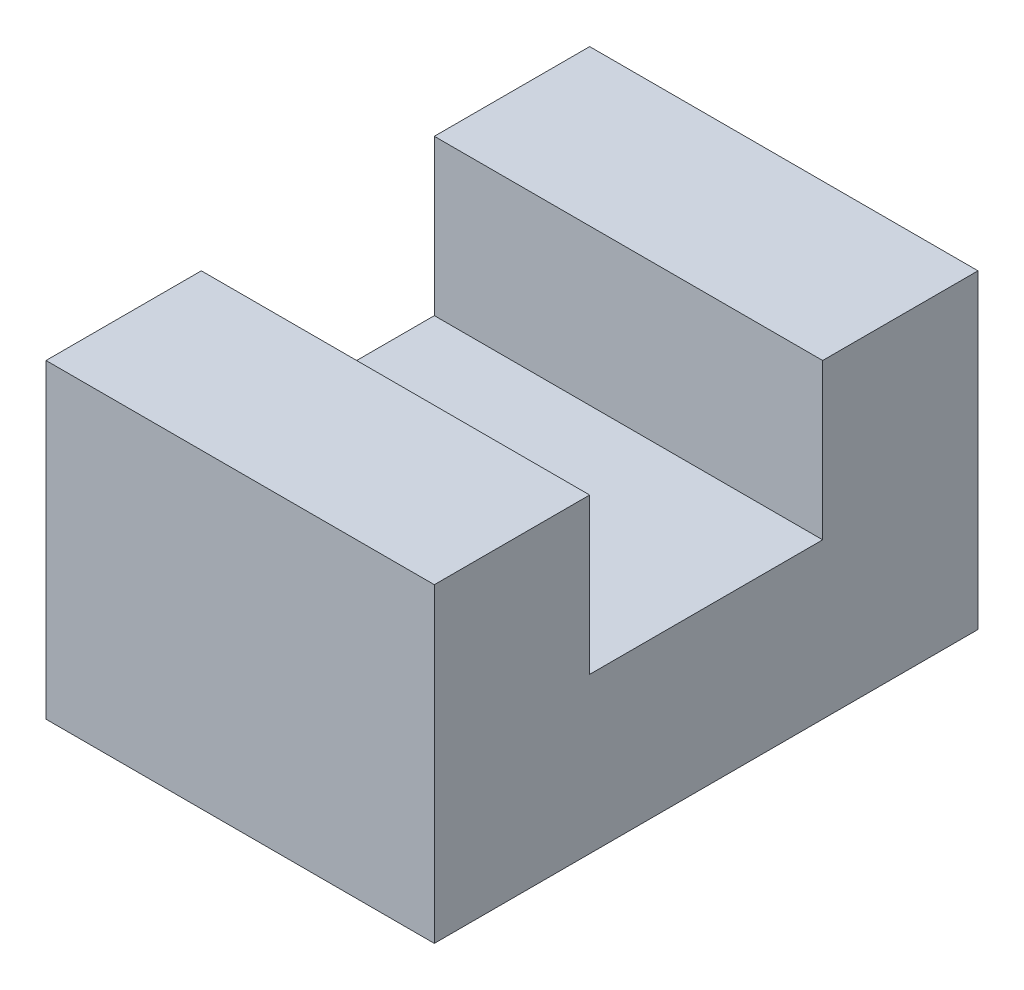
ISO-10303-21;
HEADER;
FILE_DESCRIPTION(('STEP AP214'),'2;1');
FILE_NAME('part.step','',(''),(''),'','','');
FILE_SCHEMA(('AUTOMOTIVE_DESIGN { 1 0 10303 214 1 1 1 1 }'));
ENDSEC;
DATA;
#1=APPLICATION_CONTEXT('core data for automotive mechanical design processes');
#2=APPLICATION_PROTOCOL_DEFINITION('international standard','automotive_design',2000,#1);
#3=PRODUCT_CONTEXT('',#1,'mechanical');
#4=PRODUCT('Part','Part','',(#3));
#5=PRODUCT_RELATED_PRODUCT_CATEGORY('part','',(#4));
#6=PRODUCT_DEFINITION_FORMATION('','',#4);
#7=PRODUCT_DEFINITION_CONTEXT('part definition',#1,'design');
#8=PRODUCT_DEFINITION('design','',#6,#7);
#9=PRODUCT_DEFINITION_SHAPE('','',#8);
#10=(LENGTH_UNIT() NAMED_UNIT(*) SI_UNIT(.MILLI.,.METRE.));
#11=(NAMED_UNIT(*) PLANE_ANGLE_UNIT() SI_UNIT($,.RADIAN.));
#12=(NAMED_UNIT(*) SI_UNIT($,.STERADIAN.) SOLID_ANGLE_UNIT());
#13=UNCERTAINTY_MEASURE_WITH_UNIT(LENGTH_MEASURE(1.E-05),#10,'distance_accuracy_value','');
#14=(GEOMETRIC_REPRESENTATION_CONTEXT(3) GLOBAL_UNCERTAINTY_ASSIGNED_CONTEXT((#13)) GLOBAL_UNIT_ASSIGNED_CONTEXT((#10,
#11,#12)) REPRESENTATION_CONTEXT('',''));
#15=CARTESIAN_POINT('',(0.,0.,0.));
#16=DIRECTION('',(0.,0.,1.));
#17=DIRECTION('',(1.,0.,0.));
#18=AXIS2_PLACEMENT_3D('',#15,#16,#17);
#19=CARTESIAN_POINT('',(0.,2.,0.));
#20=DIRECTION('',(0.,1.,0.));
#21=DIRECTION('',(0.,0.,1.));
#22=AXIS2_PLACEMENT_3D('',#19,#20,#21);
#23=PLANE('',#22);
#24=DIRECTION('',(0.,0.,1.));
#25=VECTOR('',#24,1.);
#26=CARTESIAN_POINT('',(-10.0524129011398,2.,22.6417303495147));
#27=LINE('',#26,#25);
#28=CARTESIAN_POINT('',(-10.0524129011398,2.,24.6417303495147));
#29=VERTEX_POINT('',#28);
#30=CARTESIAN_POINT('',(-10.0524129011398,2.,27.6417303495147));
#31=VERTEX_POINT('',#30);
#32=EDGE_CURVE('E145',#29,#31,#27,.T.);
#33=ORIENTED_EDGE('',*,*,#32,.T.);
#34=DIRECTION('',(-1.,0.,0.));
#35=VECTOR('',#34,1.);
#36=CARTESIAN_POINT('',(-10.0524129011398,2.,27.6417303495147));
#37=LINE('',#36,#35);
#38=CARTESIAN_POINT('',(-5.05241290113979,2.,27.6417303495147));
#39=VERTEX_POINT('',#38);
#40=EDGE_CURVE('E118',#39,#31,#37,.T.);
#41=ORIENTED_EDGE('',*,*,#40,.F.);
#42=DIRECTION('',(0.,0.,1.));
#43=VECTOR('',#42,1.);
#44=CARTESIAN_POINT('',(-5.05241290113979,2.,22.6417303495147));
#45=LINE('',#44,#43);
#46=CARTESIAN_POINT('',(-5.05241290113979,2.,24.6417303495147));
#47=VERTEX_POINT('',#46);
#48=EDGE_CURVE('E147',#47,#39,#45,.T.);
#49=ORIENTED_EDGE('',*,*,#48,.F.);
#50=DIRECTION('',(1.,0.,0.));
#51=VECTOR('',#50,1.);
#52=CARTESIAN_POINT('',(-10.0524129011398,2.,24.6417303495147));
#53=LINE('',#52,#51);
#54=EDGE_CURVE('E56',#29,#47,#53,.T.);
#55=ORIENTED_EDGE('',*,*,#54,.F.);
#56=EDGE_LOOP('',(#33,#41,#49,#55));
#57=FACE_BOUND('',#56,.T.);
#58=ADVANCED_FACE('F33',(#57),#23,.T.);
#59=CARTESIAN_POINT('',(-10.0524129011398,2.,22.6417303495147));
#60=DIRECTION('',(1.,0.,0.));
#61=DIRECTION('',(0.,0.,-1.));
#62=AXIS2_PLACEMENT_3D('',#59,#60,#61);
#63=PLANE('',#62);
#64=DIRECTION('',(0.,0.,1.));
#65=VECTOR('',#64,1.);
#66=CARTESIAN_POINT('',(-10.0524129011398,0.,22.6417303495147));
#67=LINE('',#66,#65);
#68=CARTESIAN_POINT('',(-10.0524129011398,0.,22.6417303495147));
#69=VERTEX_POINT('',#68);
#70=CARTESIAN_POINT('',(-10.0524129011398,0.,29.6417303495147));
#71=VERTEX_POINT('',#70);
#72=EDGE_CURVE('E105',#69,#71,#67,.T.);
#73=ORIENTED_EDGE('',*,*,#72,.T.);
#74=DIRECTION('',(0.,-1.,0.));
#75=VECTOR('',#74,1.);
#76=CARTESIAN_POINT('',(-10.0524129011398,2.,29.6417303495147));
#77=LINE('',#76,#75);
#78=CARTESIAN_POINT('',(-10.0524129011398,4.,29.6417303495147));
#79=VERTEX_POINT('',#78);
#80=EDGE_CURVE('E11',#79,#71,#77,.T.);
#81=ORIENTED_EDGE('',*,*,#80,.F.);
#82=DIRECTION('',(0.,0.,1.));
#83=VECTOR('',#82,1.);
#84=CARTESIAN_POINT('',(-10.0524129011398,4.,29.6417303495147));
#85=LINE('',#84,#83);
#86=CARTESIAN_POINT('',(-10.0524129011398,4.,27.6417303495147));
#87=VERTEX_POINT('',#86);
#88=EDGE_CURVE('E103',#87,#79,#85,.T.);
#89=ORIENTED_EDGE('',*,*,#88,.F.);
#90=DIRECTION('',(0.,-1.,0.));
#91=VECTOR('',#90,1.);
#92=CARTESIAN_POINT('',(-10.0524129011398,4.,27.6417303495147));
#93=LINE('',#92,#91);
#94=EDGE_CURVE('E123',#87,#31,#93,.T.);
#95=ORIENTED_EDGE('',*,*,#94,.T.);
#96=ORIENTED_EDGE('',*,*,#32,.F.);
#97=DIRECTION('',(0.,-1.,0.));
#98=VECTOR('',#97,1.);
#99=CARTESIAN_POINT('',(-10.0524129011398,4.,24.6417303495147));
#100=LINE('',#99,#98);
#101=CARTESIAN_POINT('',(-10.0524129011398,4.,24.6417303495147));
#102=VERTEX_POINT('',#101);
#103=EDGE_CURVE('E142',#102,#29,#100,.T.);
#104=ORIENTED_EDGE('',*,*,#103,.F.);
#105=DIRECTION('',(0.,0.,1.));
#106=VECTOR('',#105,1.);
#107=CARTESIAN_POINT('',(-10.0524129011398,4.,22.6417303495147));
#108=LINE('',#107,#106);
#109=CARTESIAN_POINT('',(-10.0524129011398,4.,22.6417303495147));
#110=VERTEX_POINT('',#109);
#111=EDGE_CURVE('E127',#110,#102,#108,.T.);
#112=ORIENTED_EDGE('',*,*,#111,.F.);
#113=DIRECTION('',(0.,-1.,0.));
#114=VECTOR('',#113,1.);
#115=CARTESIAN_POINT('',(-10.0524129011398,2.,22.6417303495147));
#116=LINE('',#115,#114);
#117=EDGE_CURVE('E151',#110,#69,#116,.T.);
#118=ORIENTED_EDGE('',*,*,#117,.T.);
#119=EDGE_LOOP('',(#73,#81,#89,#95,#96,#104,#112,#118));
#120=FACE_BOUND('',#119,.T.);
#121=ADVANCED_FACE('F35',(#120),#63,.F.);
#122=CARTESIAN_POINT('',(-10.0524129011398,2.,29.6417303495147));
#123=DIRECTION('',(0.,0.,-1.));
#124=DIRECTION('',(-1.,0.,0.));
#125=AXIS2_PLACEMENT_3D('',#122,#123,#124);
#126=PLANE('',#125);
#127=DIRECTION('',(1.,0.,0.));
#128=VECTOR('',#127,1.);
#129=CARTESIAN_POINT('',(-10.0524129011398,0.,29.6417303495147));
#130=LINE('',#129,#128);
#131=CARTESIAN_POINT('',(-5.05241290113979,0.,29.6417303495147));
#132=VERTEX_POINT('',#131);
#133=EDGE_CURVE('E153',#71,#132,#130,.T.);
#134=ORIENTED_EDGE('',*,*,#133,.T.);
#135=DIRECTION('',(0.,-1.,0.));
#136=VECTOR('',#135,1.);
#137=CARTESIAN_POINT('',(-5.05241290113979,2.,29.6417303495147));
#138=LINE('',#137,#136);
#139=CARTESIAN_POINT('',(-5.05241290113979,4.,29.6417303495147));
#140=VERTEX_POINT('',#139);
#141=EDGE_CURVE('E41',#140,#132,#138,.T.);
#142=ORIENTED_EDGE('',*,*,#141,.F.);
#143=DIRECTION('',(1.,0.,0.));
#144=VECTOR('',#143,1.);
#145=CARTESIAN_POINT('',(-10.0524129011398,4.,29.6417303495147));
#146=LINE('',#145,#144);
#147=EDGE_CURVE('E109',#79,#140,#146,.T.);
#148=ORIENTED_EDGE('',*,*,#147,.F.);
#149=ORIENTED_EDGE('',*,*,#80,.T.);
#150=EDGE_LOOP('',(#134,#142,#148,#149));
#151=FACE_BOUND('',#150,.T.);
#152=ADVANCED_FACE('F110',(#151),#126,.F.);
#153=CARTESIAN_POINT('',(-5.05241290113979,2.,22.6417303495147));
#154=DIRECTION('',(1.,0.,0.));
#155=DIRECTION('',(0.,0.,-1.));
#156=AXIS2_PLACEMENT_3D('',#153,#154,#155);
#157=PLANE('',#156);
#158=DIRECTION('',(0.,0.,1.));
#159=VECTOR('',#158,1.);
#160=CARTESIAN_POINT('',(-5.05241290113979,0.,22.6417303495147));
#161=LINE('',#160,#159);
#162=CARTESIAN_POINT('',(-5.05241290113979,0.,22.6417303495147));
#163=VERTEX_POINT('',#162);
#164=EDGE_CURVE('E155',#163,#132,#161,.T.);
#165=ORIENTED_EDGE('',*,*,#164,.F.);
#166=DIRECTION('',(0.,-1.,0.));
#167=VECTOR('',#166,1.);
#168=CARTESIAN_POINT('',(-5.05241290113979,2.,22.6417303495147));
#169=LINE('',#168,#167);
#170=CARTESIAN_POINT('',(-5.05241290113979,4.,22.6417303495147));
#171=VERTEX_POINT('',#170);
#172=EDGE_CURVE('E161',#171,#163,#169,.T.);
#173=ORIENTED_EDGE('',*,*,#172,.F.);
#174=DIRECTION('',(0.,0.,-1.));
#175=VECTOR('',#174,1.);
#176=CARTESIAN_POINT('',(-5.05241290113979,4.,22.6417303495147));
#177=LINE('',#176,#175);
#178=CARTESIAN_POINT('',(-5.05241290113979,4.,24.6417303495147));
#179=VERTEX_POINT('',#178);
#180=EDGE_CURVE('E132',#179,#171,#177,.T.);
#181=ORIENTED_EDGE('',*,*,#180,.F.);
#182=DIRECTION('',(0.,-1.,0.));
#183=VECTOR('',#182,1.);
#184=CARTESIAN_POINT('',(-5.05241290113979,4.,24.6417303495147));
#185=LINE('',#184,#183);
#186=EDGE_CURVE('E138',#179,#47,#185,.T.);
#187=ORIENTED_EDGE('',*,*,#186,.T.);
#188=ORIENTED_EDGE('',*,*,#48,.T.);
#189=DIRECTION('',(0.,-1.,0.));
#190=VECTOR('',#189,1.);
#191=CARTESIAN_POINT('',(-5.05241290113979,4.,27.6417303495147));
#192=LINE('',#191,#190);
#193=CARTESIAN_POINT('',(-5.05241290113979,4.,27.6417303495147));
#194=VERTEX_POINT('',#193);
#195=EDGE_CURVE('E48',#194,#39,#192,.T.);
#196=ORIENTED_EDGE('',*,*,#195,.F.);
#197=DIRECTION('',(0.,0.,-1.));
#198=VECTOR('',#197,1.);
#199=CARTESIAN_POINT('',(-5.05241290113979,4.,29.6417303495147));
#200=LINE('',#199,#198);
#201=EDGE_CURVE('E113',#140,#194,#200,.T.);
#202=ORIENTED_EDGE('',*,*,#201,.F.);
#203=ORIENTED_EDGE('',*,*,#141,.T.);
#204=EDGE_LOOP('',(#165,#173,#181,#187,#188,#196,#202,#203));
#205=FACE_BOUND('',#204,.T.);
#206=ADVANCED_FACE('F164',(#205),#157,.T.);
#207=CARTESIAN_POINT('',(-10.0524129011398,2.,22.6417303495147));
#208=DIRECTION('',(0.,0.,-1.));
#209=DIRECTION('',(-1.,0.,0.));
#210=AXIS2_PLACEMENT_3D('',#207,#208,#209);
#211=PLANE('',#210);
#212=DIRECTION('',(1.,0.,0.));
#213=VECTOR('',#212,1.);
#214=CARTESIAN_POINT('',(-10.0524129011398,0.,22.6417303495147));
#215=LINE('',#214,#213);
#216=EDGE_CURVE('E148',#69,#163,#215,.T.);
#217=ORIENTED_EDGE('',*,*,#216,.F.);
#218=ORIENTED_EDGE('',*,*,#117,.F.);
#219=DIRECTION('',(-1.,0.,0.));
#220=VECTOR('',#219,1.);
#221=CARTESIAN_POINT('',(-10.0524129011398,4.,22.6417303495147));
#222=LINE('',#221,#220);
#223=EDGE_CURVE('E135',#171,#110,#222,.T.);
#224=ORIENTED_EDGE('',*,*,#223,.F.);
#225=ORIENTED_EDGE('',*,*,#172,.T.);
#226=EDGE_LOOP('',(#217,#218,#224,#225));
#227=FACE_BOUND('',#226,.T.);
#228=ADVANCED_FACE('F169',(#227),#211,.T.);
#229=CARTESIAN_POINT('',(0.,0.,0.));
#230=DIRECTION('',(0.,1.,0.));
#231=DIRECTION('',(0.,0.,1.));
#232=AXIS2_PLACEMENT_3D('',#229,#230,#231);
#233=PLANE('',#232);
#234=ORIENTED_EDGE('',*,*,#72,.F.);
#235=ORIENTED_EDGE('',*,*,#216,.T.);
#236=ORIENTED_EDGE('',*,*,#164,.T.);
#237=ORIENTED_EDGE('',*,*,#133,.F.);
#238=EDGE_LOOP('',(#234,#235,#236,#237));
#239=FACE_BOUND('',#238,.T.);
#240=ADVANCED_FACE('F166',(#239),#233,.F.);
#241=CARTESIAN_POINT('',(-10.0524129011398,4.,24.6417303495147));
#242=DIRECTION('',(0.,0.,-1.));
#243=DIRECTION('',(-1.,0.,0.));
#244=AXIS2_PLACEMENT_3D('',#241,#242,#243);
#245=PLANE('',#244);
#246=ORIENTED_EDGE('',*,*,#54,.T.);
#247=ORIENTED_EDGE('',*,*,#186,.F.);
#248=DIRECTION('',(1.,0.,0.));
#249=VECTOR('',#248,1.);
#250=CARTESIAN_POINT('',(-10.0524129011398,4.,24.6417303495147));
#251=LINE('',#250,#249);
#252=EDGE_CURVE('E130',#102,#179,#251,.T.);
#253=ORIENTED_EDGE('',*,*,#252,.F.);
#254=ORIENTED_EDGE('',*,*,#103,.T.);
#255=EDGE_LOOP('',(#246,#247,#253,#254));
#256=FACE_BOUND('',#255,.T.);
#257=ADVANCED_FACE('F178',(#256),#245,.F.);
#258=CARTESIAN_POINT('',(0.,4.,0.));
#259=DIRECTION('',(0.,1.,0.));
#260=DIRECTION('',(0.,0.,1.));
#261=AXIS2_PLACEMENT_3D('',#258,#259,#260);
#262=PLANE('',#261);
#263=ORIENTED_EDGE('',*,*,#111,.T.);
#264=ORIENTED_EDGE('',*,*,#252,.T.);
#265=ORIENTED_EDGE('',*,*,#180,.T.);
#266=ORIENTED_EDGE('',*,*,#223,.T.);
#267=EDGE_LOOP('',(#263,#264,#265,#266));
#268=FACE_BOUND('',#267,.T.);
#269=ADVANCED_FACE('F173',(#268),#262,.T.);
#270=CARTESIAN_POINT('',(-10.0524129011398,4.,27.6417303495147));
#271=DIRECTION('',(0.,0.,1.));
#272=DIRECTION('',(1.,0.,0.));
#273=AXIS2_PLACEMENT_3D('',#270,#271,#272);
#274=PLANE('',#273);
#275=ORIENTED_EDGE('',*,*,#40,.T.);
#276=ORIENTED_EDGE('',*,*,#94,.F.);
#277=DIRECTION('',(-1.,0.,0.));
#278=VECTOR('',#277,1.);
#279=CARTESIAN_POINT('',(-10.0524129011398,4.,27.6417303495147));
#280=LINE('',#279,#278);
#281=EDGE_CURVE('E116',#194,#87,#280,.T.);
#282=ORIENTED_EDGE('',*,*,#281,.F.);
#283=ORIENTED_EDGE('',*,*,#195,.T.);
#284=EDGE_LOOP('',(#275,#276,#282,#283));
#285=FACE_BOUND('',#284,.T.);
#286=ADVANCED_FACE('F179',(#285),#274,.F.);
#287=CARTESIAN_POINT('',(0.,4.,0.));
#288=DIRECTION('',(0.,-1.,0.));
#289=DIRECTION('',(0.,0.,-1.));
#290=AXIS2_PLACEMENT_3D('',#287,#288,#289);
#291=PLANE('',#290);
#292=ORIENTED_EDGE('',*,*,#88,.T.);
#293=ORIENTED_EDGE('',*,*,#147,.T.);
#294=ORIENTED_EDGE('',*,*,#201,.T.);
#295=ORIENTED_EDGE('',*,*,#281,.T.);
#296=EDGE_LOOP('',(#292,#293,#294,#295));
#297=FACE_BOUND('',#296,.T.);
#298=ADVANCED_FACE('F115',(#297),#291,.F.);
#299=CLOSED_SHELL('',(#58,#121,#152,#206,#228,#240,#257,#269,#286,#298));
#300=MANIFOLD_SOLID_BREP('B2',#299);
#301=ADVANCED_BREP_SHAPE_REPRESENTATION('',(#18,#300),#14);
#302=SHAPE_DEFINITION_REPRESENTATION(#9,#301);
ENDSEC;
END-ISO-10303-21;
